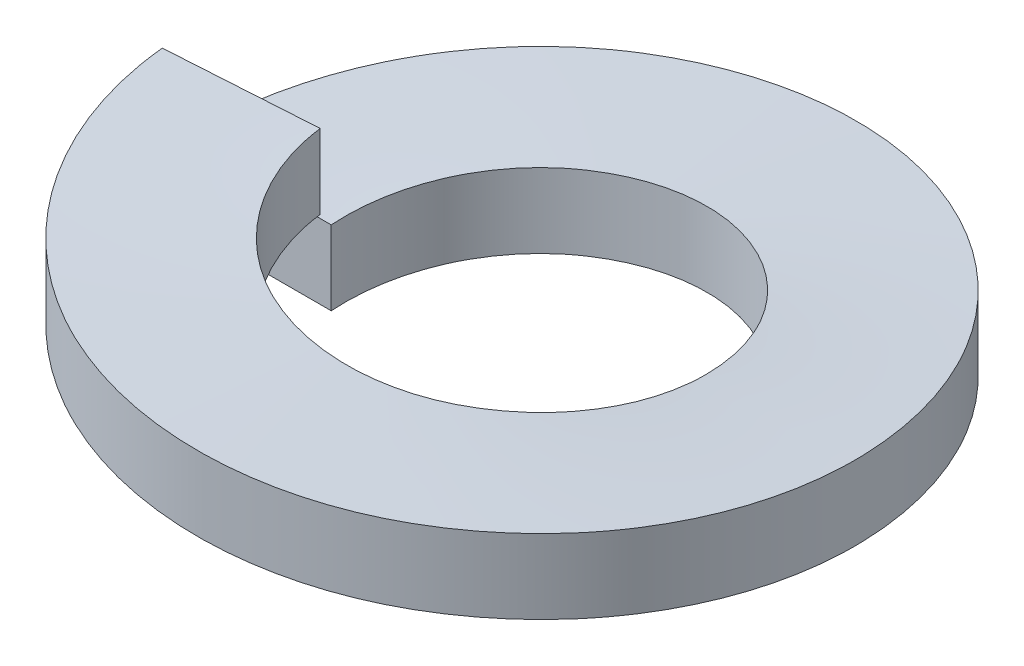
ISO-10303-21;
HEADER;
FILE_DESCRIPTION(('STEP AP214'),'2;1');
FILE_NAME('part.step','',(''),(''),'','','');
FILE_SCHEMA(('AUTOMOTIVE_DESIGN { 1 0 10303 214 1 1 1 1 }'));
ENDSEC;
DATA;
#1=APPLICATION_CONTEXT('core data for automotive mechanical design processes');
#2=APPLICATION_PROTOCOL_DEFINITION('international standard','automotive_design',2000,#1);
#3=PRODUCT_CONTEXT('',#1,'mechanical');
#4=PRODUCT('Part','Part','',(#3));
#5=PRODUCT_RELATED_PRODUCT_CATEGORY('part','',(#4));
#6=PRODUCT_DEFINITION_FORMATION('','',#4);
#7=PRODUCT_DEFINITION_CONTEXT('part definition',#1,'design');
#8=PRODUCT_DEFINITION('design','',#6,#7);
#9=PRODUCT_DEFINITION_SHAPE('','',#8);
#10=(LENGTH_UNIT() NAMED_UNIT(*) SI_UNIT(.MILLI.,.METRE.));
#11=(NAMED_UNIT(*) PLANE_ANGLE_UNIT() SI_UNIT($,.RADIAN.));
#12=(NAMED_UNIT(*) SI_UNIT($,.STERADIAN.) SOLID_ANGLE_UNIT());
#13=UNCERTAINTY_MEASURE_WITH_UNIT(LENGTH_MEASURE(1.E-05),#10,'distance_accuracy_value','');
#14=(GEOMETRIC_REPRESENTATION_CONTEXT(3) GLOBAL_UNCERTAINTY_ASSIGNED_CONTEXT((#13)) GLOBAL_UNIT_ASSIGNED_CONTEXT((#10,
#11,#12)) REPRESENTATION_CONTEXT('',''));
#15=CARTESIAN_POINT('',(0.,0.,0.));
#16=DIRECTION('',(0.,0.,1.));
#17=DIRECTION('',(1.,0.,0.));
#18=AXIS2_PLACEMENT_3D('',#15,#16,#17);
#19=CARTESIAN_POINT('',(-3.1,0.,0.));
#20=DIRECTION('',(0.,0.,0.999999999999998));
#21=DIRECTION('',(0.999999999999998,0.,0.));
#22=AXIS2_PLACEMENT_3D('',#19,#20,#21);
#23=PLANE('',#22);
#24=DIRECTION('',(0.,-1.,0.));
#25=VECTOR('',#24,1.);
#26=CARTESIAN_POINT('',(-3.1,0.70000000000002,0.));
#27=LINE('',#26,#25);
#28=CARTESIAN_POINT('',(-3.1,0.70000000000002,0.));
#29=VERTEX_POINT('',#28);
#30=CARTESIAN_POINT('',(-3.1,0.,0.));
#31=VERTEX_POINT('',#30);
#32=EDGE_CURVE('E89',#29,#31,#27,.T.);
#33=ORIENTED_EDGE('',*,*,#32,.T.);
#34=DIRECTION('',(0.999999999999998,0.,0.));
#35=VECTOR('',#34,1.);
#36=CARTESIAN_POINT('',(-3.1,0.,0.));
#37=LINE('',#36,#35);
#38=CARTESIAN_POINT('',(-1.69999999999999,0.,0.));
#39=VERTEX_POINT('',#38);
#40=EDGE_CURVE('E82',#31,#39,#37,.T.);
#41=ORIENTED_EDGE('',*,*,#40,.T.);
#42=DIRECTION('',(0.,1.,0.));
#43=VECTOR('',#42,1.);
#44=CARTESIAN_POINT('',(-1.69999999999997,0.699999999999985,0.));
#45=LINE('',#44,#43);
#46=CARTESIAN_POINT('',(-1.69999999999997,0.699999999999985,0.));
#47=VERTEX_POINT('',#46);
#48=EDGE_CURVE('E77',#39,#47,#45,.T.);
#49=ORIENTED_EDGE('',*,*,#48,.T.);
#50=DIRECTION('',(-0.999999999999998,0.,0.));
#51=VECTOR('',#50,1.);
#52=CARTESIAN_POINT('',(-3.1,0.70000000000002,0.));
#53=LINE('',#52,#51);
#54=EDGE_CURVE('E72',#47,#29,#53,.T.);
#55=ORIENTED_EDGE('',*,*,#54,.T.);
#56=EDGE_LOOP('',(#33,#41,#49,#55));
#57=FACE_BOUND('',#56,.T.);
#58=ADVANCED_FACE('F37',(#57),#23,.T.);
#59=CARTESIAN_POINT('',(-3.09388285812766,0.840000000000007,0.194650610540827));
#60=DIRECTION('',(0.0627905195293,0.,0.998026728428271));
#61=DIRECTION('',(0.998026728428271,0.,-0.0627905195292998));
#62=AXIS2_PLACEMENT_3D('',#59,#60,#61);
#63=PLANE('',#62);
#64=DIRECTION('',(0.,-1.,0.));
#65=VECTOR('',#64,1.);
#66=CARTESIAN_POINT('',(-3.09388285812766,1.54000000000001,0.194650610540834));
#67=LINE('',#66,#65);
#68=CARTESIAN_POINT('',(-3.09388285812766,1.54000000000001,0.194650610540834));
#69=VERTEX_POINT('',#68);
#70=CARTESIAN_POINT('',(-3.09388285812766,0.840000000000007,0.194650610540827));
#71=VERTEX_POINT('',#70);
#72=EDGE_CURVE('E97',#69,#71,#67,.T.);
#73=ORIENTED_EDGE('',*,*,#72,.F.);
#74=DIRECTION('',(-0.998026728428271,0.,0.0627905195293001));
#75=VECTOR('',#74,1.);
#76=CARTESIAN_POINT('',(-3.09388285812766,1.54000000000001,0.194650610540834));
#77=LINE('',#76,#75);
#78=CARTESIAN_POINT('',(-1.69664543832809,1.53999999999997,0.106743883199794));
#79=VERTEX_POINT('',#78);
#80=EDGE_CURVE('E11',#79,#69,#77,.T.);
#81=ORIENTED_EDGE('',*,*,#80,.F.);
#82=DIRECTION('',(0.,1.,0.));
#83=VECTOR('',#82,1.);
#84=CARTESIAN_POINT('',(-1.69664543832806,1.54000000000003,0.106743883199818));
#85=LINE('',#84,#83);
#86=CARTESIAN_POINT('',(-1.69664543832809,0.840000000000001,0.106743883199801));
#87=VERTEX_POINT('',#86);
#88=EDGE_CURVE('E51',#87,#79,#85,.T.);
#89=ORIENTED_EDGE('',*,*,#88,.F.);
#90=DIRECTION('',(0.998026728428271,0.,-0.0627905195292998));
#91=VECTOR('',#90,1.);
#92=CARTESIAN_POINT('',(-3.09388285812766,0.840000000000007,0.194650610540827));
#93=LINE('',#92,#91);
#94=EDGE_CURVE('E60',#71,#87,#93,.T.);
#95=ORIENTED_EDGE('',*,*,#94,.F.);
#96=EDGE_LOOP('',(#73,#81,#89,#95));
#97=FACE_BOUND('',#96,.T.);
#98=ADVANCED_FACE('F143',(#97),#63,.F.);
#99=CARTESIAN_POINT('',(0.,0.,0.));
#100=DIRECTION('',(0.,1.,0.));
#101=DIRECTION('',(0.,0.,0.999999999999998));
#102=AXIS2_PLACEMENT_3D('',#99,#100,#101);
#103=CYLINDRICAL_SURFACE('',#102,3.1);
#104=CARTESIAN_POINT('',(-3.1,0.,0.));
#105=CARTESIAN_POINT('',(-3.1,0.0699999999999978,-1.76820878198722));
#106=CARTESIAN_POINT('',(-1.57802838882613,0.140000000000008,-2.66830028371223));
#107=CARTESIAN_POINT('',(-0.0560567776523055,0.209999999999985,-3.56839178543724));
#108=CARTESIAN_POINT('',(1.49343638971535,0.279999999999982,-2.71655070813597));
#109=CARTESIAN_POINT('',(3.04292955708292,0.349999999999997,-1.8647096308347));
#110=CARTESIAN_POINT('',(3.09847033713378,0.41999999999999,-0.097373353142173));
#111=CARTESIAN_POINT('',(3.15401111718463,0.490000000000009,1.66996292455035));
#112=CARTESIAN_POINT('',(1.66106306443486,0.560000000000026,2.61741656905624));
#113=CARTESIAN_POINT('',(0.168115011685131,0.630000000000004,3.56487021356219));
#114=CARTESIAN_POINT('',(-1.40737054919263,0.699999999999985,2.76212022498392));
#115=CARTESIAN_POINT('',(-2.9828561100704,0.769999999999992,1.95937023640568));
#116=CARTESIAN_POINT('',(-3.09388285812766,0.840000000000007,0.194650610540827));
#117=(BOUNDED_CURVE() B_SPLINE_CURVE(2,(#104,#105,#106,#107,#108,#109,#110,#111,#112,#113,#114,
#115,#116),.UNSPECIFIED.,.F.,.F.) B_SPLINE_CURVE_WITH_KNOTS((3,2,2,2,2,2,3),(0.,
0.166666666666667,0.333333333333333,0.5,0.666666666666667,0.833333333333333,1.),
.UNSPECIFIED.) CURVE() GEOMETRIC_REPRESENTATION_ITEM() RATIONAL_B_SPLINE_CURVE((1.,
0.868631514438191,1.,0.868631514438191,1.,0.868631514438191,1.,0.868631514438191,1.,
0.868631514438191,1.,0.868631514438191,1.)) REPRESENTATION_ITEM(''));
#118=EDGE_CURVE('E92',#31,#71,#117,.T.);
#119=ORIENTED_EDGE('',*,*,#118,.F.);
#120=ORIENTED_EDGE('',*,*,#32,.F.);
#121=CARTESIAN_POINT('',(-3.1,0.70000000000002,0.));
#122=CARTESIAN_POINT('',(-3.09999999999999,0.770000000000008,-1.7682087819872));
#123=CARTESIAN_POINT('',(-1.57802838882615,0.840000000000001,-2.66830028371223));
#124=CARTESIAN_POINT('',(-0.0560567776522976,0.909999999999987,-3.56839178543723));
#125=CARTESIAN_POINT('',(1.49343638971535,0.980000000000016,-2.71655070813598));
#126=CARTESIAN_POINT('',(3.0429295570829,1.05000000000002,-1.8647096308347));
#127=CARTESIAN_POINT('',(3.09847033713378,1.12,-0.0973733531421765));
#128=CARTESIAN_POINT('',(3.15401111718461,1.19000000000002,1.66996292455035));
#129=CARTESIAN_POINT('',(1.66106306443484,1.26000000000001,2.61741656905626));
#130=CARTESIAN_POINT('',(0.168115011685163,1.32999999999997,3.56487021356217));
#131=CARTESIAN_POINT('',(-1.40737054919263,1.40000000000002,2.76212022498392));
#132=CARTESIAN_POINT('',(-2.98285611007038,1.47000000000002,1.95937023640567));
#133=CARTESIAN_POINT('',(-3.09388285812766,1.54000000000001,0.194650610540834));
#134=(BOUNDED_CURVE() B_SPLINE_CURVE(2,(#121,#122,#123,#124,#125,#126,#127,#128,#129,#130,#131,
#132,#133),.UNSPECIFIED.,.F.,.F.) B_SPLINE_CURVE_WITH_KNOTS((3,2,2,2,2,2,3),(0.,
0.166666666666667,0.333333333333333,0.5,0.666666666666667,0.833333333333333,1.),
.UNSPECIFIED.) CURVE() GEOMETRIC_REPRESENTATION_ITEM() RATIONAL_B_SPLINE_CURVE((1.,
0.868631514438191,1.,0.868631514438191,1.,0.868631514438191,1.,0.868631514438191,1.,
0.868631514438191,1.,0.868631514438191,1.)) REPRESENTATION_ITEM(''));
#135=EDGE_CURVE('E91',#29,#69,#134,.T.);
#136=ORIENTED_EDGE('',*,*,#135,.T.);
#137=ORIENTED_EDGE('',*,*,#72,.T.);
#138=EDGE_LOOP('',(#119,#120,#136,#137));
#139=FACE_BOUND('',#138,.T.);
#140=ADVANCED_FACE('F90',(#139),#103,.T.);
#141=CARTESIAN_POINT('',(-3.1,0.,0.));
#142=CARTESIAN_POINT('',(-3.10000000000002,0.0700000000000138,-1.76820878198722));
#143=CARTESIAN_POINT('',(-1.57802838882613,0.140000000000008,-2.66830028371223));
#144=CARTESIAN_POINT('',(-0.0560567776523135,0.210000000000041,-3.56839178543724));
#145=CARTESIAN_POINT('',(1.49343638971535,0.279999999999982,-2.71655070813597));
#146=CARTESIAN_POINT('',(3.04292955708292,0.350000000000021,-1.86470963083469));
#147=CARTESIAN_POINT('',(3.09847033713378,0.420000000000018,-0.0973733531421696));
#148=CARTESIAN_POINT('',(3.15401111718454,0.490000000000009,1.66996292455035));
#149=CARTESIAN_POINT('',(1.66106306443486,0.560000000000026,2.61741656905624));
#150=CARTESIAN_POINT('',(0.168115011685115,0.630000000000012,3.56487021356219));
#151=CARTESIAN_POINT('',(-1.40737054919263,0.699999999999985,2.76212022498392));
#152=CARTESIAN_POINT('',(-2.98285611007041,0.770000000000032,1.95937023640567));
#153=CARTESIAN_POINT('',(-3.09388285812766,0.840000000000007,0.194650610540827));
#154=CARTESIAN_POINT('',(-1.69999999999999,0.,0.));
#155=CARTESIAN_POINT('',(-1.70000000000002,0.0700000000000298,-0.969662880444592));
#156=CARTESIAN_POINT('',(-0.865370406775666,0.140000000000036,-1.4632614459067));
#157=CARTESIAN_POINT('',(-0.0307408135512839,0.210000000000025,-1.9568600113688));
#158=CARTESIAN_POINT('',(0.818981245972898,0.279999999999982,-1.48972135607456));
#159=CARTESIAN_POINT('',(1.66870330549707,0.349999999999997,-1.02258270078032));
#160=CARTESIAN_POINT('',(1.69916115262173,0.420000000000025,-0.0533982904327886));
#161=CARTESIAN_POINT('',(1.72961899974636,0.490000000000041,0.915786119914717));
#162=CARTESIAN_POINT('',(0.910905551464274,0.559999999999984,1.43535747335343));
#163=CARTESIAN_POINT('',(0.0921921031821516,0.630000000000028,1.95492882679215));
#164=CARTESIAN_POINT('',(-0.771783849557242,0.699999999999985,1.51471109112021));
#165=CARTESIAN_POINT('',(-1.6357598022967,0.770000000000024,1.07449335544829));
#166=CARTESIAN_POINT('',(-1.69664543832809,0.840000000000001,0.106743883199801));
#167=(BOUNDED_SURFACE() B_SPLINE_SURFACE(1,2,((#141,#142,#143,#144,#145,#146,#147,#148,#149,
#150,#151,#152,#153),(#154,#155,#156,#157,#158,#159,#160,#161,#162,#163,#164,#165,#166)),
.UNSPECIFIED.,.F.,.F.,.F.) B_SPLINE_SURFACE_WITH_KNOTS((2,2),(3,2,2,2,2,2,3),(0.,1.),(0.,
0.166666666666667,0.333333333333333,0.5,0.666666666666667,0.833333333333333,1.),
.UNSPECIFIED.) GEOMETRIC_REPRESENTATION_ITEM() RATIONAL_B_SPLINE_SURFACE(((1.,0.868631514438191,
1.,0.868631514438191,1.,0.868631514438191,1.,0.868631514438191,1.,0.868631514438191,1.,
0.868631514438191,1.),(1.,0.868631514438191,1.,0.868631514438191,1.,0.868631514438191,1.,
0.868631514438191,1.,0.868631514438191,1.,0.868631514438191,1.))) REPRESENTATION_ITEM('') SURFACE());
#168=CARTESIAN_POINT('',(-1.69999999999999,0.,0.));
#169=CARTESIAN_POINT('',(-1.7,0.0700000000000058,-0.969662880444604));
#170=CARTESIAN_POINT('',(-0.865370406775666,0.140000000000036,-1.4632614459067));
#171=CARTESIAN_POINT('',(-0.0307408135512839,0.209999999999977,-1.95686001136879));
#172=CARTESIAN_POINT('',(0.818981245972898,0.279999999999982,-1.48972135607456));
#173=CARTESIAN_POINT('',(1.66870330549709,0.350000000000005,-1.02258270078031));
#174=CARTESIAN_POINT('',(1.69916115262173,0.420000000000025,-0.0533982904327886));
#175=CARTESIAN_POINT('',(1.72961899974636,0.490000000000009,0.915786119914707));
#176=CARTESIAN_POINT('',(0.910905551464274,0.559999999999984,1.43535747335343));
#177=CARTESIAN_POINT('',(0.0921921031821675,0.62999999999998,1.95492882679216));
#178=CARTESIAN_POINT('',(-0.771783849557242,0.699999999999985,1.51471109112021));
#179=CARTESIAN_POINT('',(-1.63575980229668,0.769999999999984,1.07449335544828));
#180=CARTESIAN_POINT('',(-1.69664543832809,0.840000000000001,0.106743883199801));
#181=(BOUNDED_CURVE() B_SPLINE_CURVE(2,(#168,#169,#170,#171,#172,#173,#174,#175,#176,#177,#178,
#179,#180),.UNSPECIFIED.,.F.,.F.) B_SPLINE_CURVE_WITH_KNOTS((3,2,2,2,2,2,3),(0.,
0.166666666666667,0.333333333333333,0.5,0.666666666666667,0.833333333333333,1.),
.UNSPECIFIED.) CURVE() GEOMETRIC_REPRESENTATION_ITEM() RATIONAL_B_SPLINE_CURVE((1.,
0.868631514438191,1.,0.868631514438191,1.,0.868631514438191,1.,0.868631514438191,1.,
0.868631514438191,1.,0.868631514438191,1.)) REPRESENTATION_ITEM(''));
#182=EDGE_CURVE('E112',#39,#87,#181,.T.);
#183=ORIENTED_EDGE('',*,*,#182,.F.);
#184=ORIENTED_EDGE('',*,*,#40,.F.);
#185=ORIENTED_EDGE('',*,*,#118,.T.);
#186=ORIENTED_EDGE('',*,*,#94,.T.);
#187=EDGE_LOOP('',(#183,#184,#185,#186));
#188=FACE_BOUND('',#187,.T.);
#189=ADVANCED_FACE('F130',(#188),#167,.F.);
#190=CARTESIAN_POINT('',(0.,0.,0.));
#191=DIRECTION('',(0.,1.,0.));
#192=DIRECTION('',(0.,0.,0.999999999999998));
#193=AXIS2_PLACEMENT_3D('',#190,#191,#192);
#194=CYLINDRICAL_SURFACE('',#193,1.7);
#195=CARTESIAN_POINT('',(-1.69999999999997,0.699999999999985,0.));
#196=CARTESIAN_POINT('',(-1.7,0.770000000000016,-0.969662880444592));
#197=CARTESIAN_POINT('',(-0.865370406775666,0.840000000000007,-1.46326144590671));
#198=CARTESIAN_POINT('',(-0.0307408135512679,0.909999999999995,-1.9568600113688));
#199=CARTESIAN_POINT('',(0.818981245972884,0.980000000000036,-1.48972135607455));
#200=CARTESIAN_POINT('',(1.66870330549709,1.04999999999999,-1.0225827007803));
#201=CARTESIAN_POINT('',(1.69916115262173,1.12000000000002,-0.053398290432799));
#202=CARTESIAN_POINT('',(1.72961899974637,1.18999999999998,0.915786119914713));
#203=CARTESIAN_POINT('',(0.91090555146426,1.26000000000003,1.43535747335345));
#204=CARTESIAN_POINT('',(0.0921921031821675,1.32999999999997,1.95492882679216));
#205=CARTESIAN_POINT('',(-0.771783849557242,1.40000000000003,1.51471109112022));
#206=CARTESIAN_POINT('',(-1.63575980229669,1.46999999999999,1.07449335544828));
#207=CARTESIAN_POINT('',(-1.69664543832809,1.53999999999997,0.106743883199794));
#208=(BOUNDED_CURVE() B_SPLINE_CURVE(2,(#195,#196,#197,#198,#199,#200,#201,#202,#203,#204,#205,
#206,#207),.UNSPECIFIED.,.F.,.F.) B_SPLINE_CURVE_WITH_KNOTS((3,2,2,2,2,2,3),(0.,
0.166666666666667,0.333333333333333,0.5,0.666666666666667,0.833333333333333,1.),
.UNSPECIFIED.) CURVE() GEOMETRIC_REPRESENTATION_ITEM() RATIONAL_B_SPLINE_CURVE((1.,
0.868631514438191,1.,0.868631514438191,1.,0.868631514438191,1.,0.868631514438191,1.,
0.868631514438191,1.,0.868631514438191,1.)) REPRESENTATION_ITEM(''));
#209=EDGE_CURVE('E44',#47,#79,#208,.T.);
#210=ORIENTED_EDGE('',*,*,#209,.F.);
#211=ORIENTED_EDGE('',*,*,#48,.F.);
#212=ORIENTED_EDGE('',*,*,#182,.T.);
#213=ORIENTED_EDGE('',*,*,#88,.T.);
#214=EDGE_LOOP('',(#210,#211,#212,#213));
#215=FACE_BOUND('',#214,.T.);
#216=ADVANCED_FACE('F128',(#215),#194,.F.);
#217=CARTESIAN_POINT('',(-1.69999999999997,0.699999999999985,0.));
#218=CARTESIAN_POINT('',(-1.7,0.770000000000016,-0.969662880444592));
#219=CARTESIAN_POINT('',(-0.865370406775666,0.840000000000007,-1.46326144590671));
#220=CARTESIAN_POINT('',(-0.0307408135512679,0.909999999999995,-1.9568600113688));
#221=CARTESIAN_POINT('',(0.818981245972884,0.980000000000036,-1.48972135607455));
#222=CARTESIAN_POINT('',(1.66870330549709,1.04999999999999,-1.0225827007803));
#223=CARTESIAN_POINT('',(1.69916115262173,1.12000000000002,-0.053398290432799));
#224=CARTESIAN_POINT('',(1.72961899974637,1.18999999999998,0.915786119914713));
#225=CARTESIAN_POINT('',(0.91090555146426,1.26000000000003,1.43535747335345));
#226=CARTESIAN_POINT('',(0.0921921031821675,1.32999999999997,1.95492882679216));
#227=CARTESIAN_POINT('',(-0.771783849557242,1.40000000000003,1.51471109112022));
#228=CARTESIAN_POINT('',(-1.63575980229669,1.46999999999999,1.07449335544828));
#229=CARTESIAN_POINT('',(-1.69664543832809,1.53999999999997,0.106743883199794));
#230=CARTESIAN_POINT('',(-3.1,0.70000000000002,0.));
#231=CARTESIAN_POINT('',(-3.09999999999999,0.770000000000008,-1.7682087819872));
#232=CARTESIAN_POINT('',(-1.57802838882615,0.840000000000001,-2.66830028371223));
#233=CARTESIAN_POINT('',(-0.0560567776522976,0.909999999999987,-3.56839178543723));
#234=CARTESIAN_POINT('',(1.49343638971535,0.980000000000016,-2.71655070813598));
#235=CARTESIAN_POINT('',(3.0429295570829,1.05000000000002,-1.8647096308347));
#236=CARTESIAN_POINT('',(3.09847033713378,1.12,-0.0973733531421765));
#237=CARTESIAN_POINT('',(3.15401111718461,1.19000000000002,1.66996292455035));
#238=CARTESIAN_POINT('',(1.66106306443484,1.26000000000001,2.61741656905626));
#239=CARTESIAN_POINT('',(0.168115011685163,1.32999999999997,3.56487021356217));
#240=CARTESIAN_POINT('',(-1.40737054919263,1.40000000000002,2.76212022498392));
#241=CARTESIAN_POINT('',(-2.98285611007038,1.47000000000002,1.95937023640567));
#242=CARTESIAN_POINT('',(-3.09388285812766,1.54000000000001,0.194650610540834));
#243=(BOUNDED_SURFACE() B_SPLINE_SURFACE(1,2,((#217,#218,#219,#220,#221,#222,#223,#224,#225,
#226,#227,#228,#229),(#230,#231,#232,#233,#234,#235,#236,#237,#238,#239,#240,#241,#242)),
.UNSPECIFIED.,.F.,.F.,.F.) B_SPLINE_SURFACE_WITH_KNOTS((2,2),(3,2,2,2,2,2,3),(0.,1.),(0.,
0.166666666666667,0.333333333333333,0.5,0.666666666666667,0.833333333333333,1.),
.UNSPECIFIED.) GEOMETRIC_REPRESENTATION_ITEM() RATIONAL_B_SPLINE_SURFACE(((1.,0.868631514438191,
1.,0.868631514438191,1.,0.868631514438191,1.,0.868631514438191,1.,0.868631514438191,1.,
0.868631514438191,1.),(1.,0.868631514438191,1.,0.868631514438191,1.,0.868631514438191,1.,
0.868631514438191,1.,0.868631514438191,1.,0.868631514438191,1.))) REPRESENTATION_ITEM('') SURFACE());
#244=ORIENTED_EDGE('',*,*,#80,.T.);
#245=ORIENTED_EDGE('',*,*,#135,.F.);
#246=ORIENTED_EDGE('',*,*,#54,.F.);
#247=ORIENTED_EDGE('',*,*,#209,.T.);
#248=EDGE_LOOP('',(#244,#245,#246,#247));
#249=FACE_BOUND('',#248,.T.);
#250=ADVANCED_FACE('F95',(#249),#243,.F.);
#251=CLOSED_SHELL('',(#58,#98,#140,#189,#216,#250));
#252=MANIFOLD_SOLID_BREP('B2',#251);
#253=ADVANCED_BREP_SHAPE_REPRESENTATION('',(#18,#252),#14);
#254=SHAPE_DEFINITION_REPRESENTATION(#9,#253);
ENDSEC;
END-ISO-10303-21;
